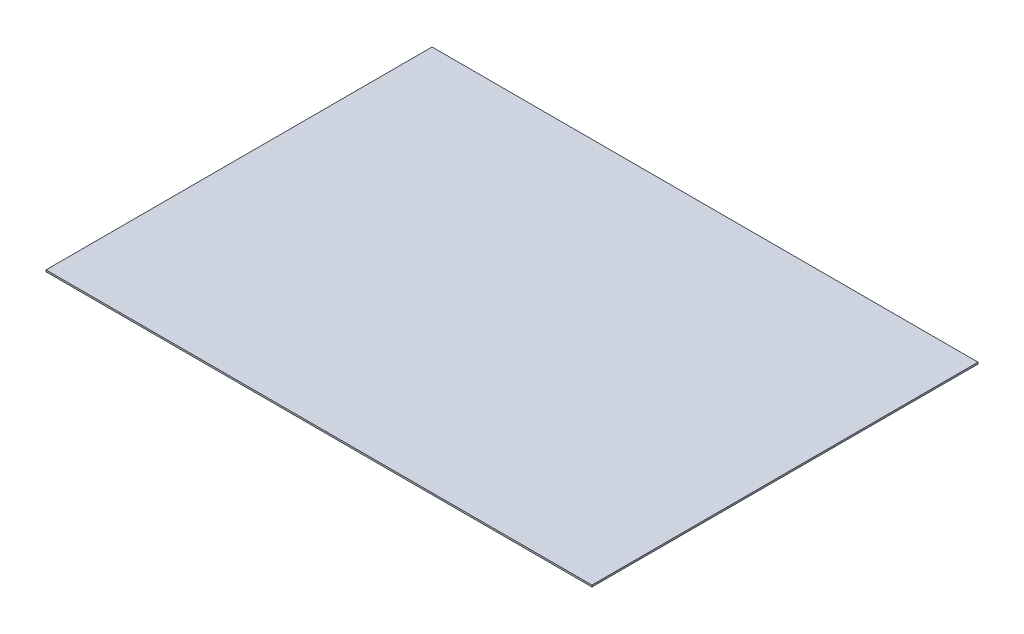
ISO-10303-21;
HEADER;
FILE_DESCRIPTION(('STEP AP214'),'2;1');
FILE_NAME('part.step','',(''),(''),'','','');
FILE_SCHEMA(('AUTOMOTIVE_DESIGN { 1 0 10303 214 1 1 1 1 }'));
ENDSEC;
DATA;
#1=APPLICATION_CONTEXT('core data for automotive mechanical design processes');
#2=APPLICATION_PROTOCOL_DEFINITION('international standard','automotive_design',2000,#1);
#3=PRODUCT_CONTEXT('',#1,'mechanical');
#4=PRODUCT('Part','Part','',(#3));
#5=PRODUCT_RELATED_PRODUCT_CATEGORY('part','',(#4));
#6=PRODUCT_DEFINITION_FORMATION('','',#4);
#7=PRODUCT_DEFINITION_CONTEXT('part definition',#1,'design');
#8=PRODUCT_DEFINITION('design','',#6,#7);
#9=PRODUCT_DEFINITION_SHAPE('','',#8);
#10=(LENGTH_UNIT() NAMED_UNIT(*) SI_UNIT(.MILLI.,.METRE.));
#11=(NAMED_UNIT(*) PLANE_ANGLE_UNIT() SI_UNIT($,.RADIAN.));
#12=(NAMED_UNIT(*) SI_UNIT($,.STERADIAN.) SOLID_ANGLE_UNIT());
#13=UNCERTAINTY_MEASURE_WITH_UNIT(LENGTH_MEASURE(1.E-05),#10,'distance_accuracy_value','');
#14=(GEOMETRIC_REPRESENTATION_CONTEXT(3) GLOBAL_UNCERTAINTY_ASSIGNED_CONTEXT((#13)) GLOBAL_UNIT_ASSIGNED_CONTEXT((#10,
#11,#12)) REPRESENTATION_CONTEXT('',''));
#15=CARTESIAN_POINT('',(0.,0.,0.));
#16=DIRECTION('',(0.,0.,1.));
#17=DIRECTION('',(1.,0.,0.));
#18=AXIS2_PLACEMENT_3D('',#15,#16,#17);
#19=CARTESIAN_POINT('',(210.,1.3,-148.5));
#20=DIRECTION('',(-1.,0.,0.));
#21=DIRECTION('',(0.,0.,1.));
#22=AXIS2_PLACEMENT_3D('',#19,#20,#21);
#23=PLANE('',#22);
#24=DIRECTION('',(0.,0.,-1.));
#25=VECTOR('',#24,1.);
#26=CARTESIAN_POINT('',(210.,0.,-148.5));
#27=LINE('',#26,#25);
#28=CARTESIAN_POINT('',(210.,0.,148.5));
#29=VERTEX_POINT('',#28);
#30=CARTESIAN_POINT('',(210.,0.,-148.5));
#31=VERTEX_POINT('',#30);
#32=EDGE_CURVE('E111',#29,#31,#27,.T.);
#33=ORIENTED_EDGE('',*,*,#32,.T.);
#34=DIRECTION('',(0.,-1.,0.));
#35=VECTOR('',#34,1.);
#36=CARTESIAN_POINT('',(210.,1.3,-148.5));
#37=LINE('',#36,#35);
#38=CARTESIAN_POINT('',(210.,1.3,-148.5));
#39=VERTEX_POINT('',#38);
#40=EDGE_CURVE('E11',#39,#31,#37,.T.);
#41=ORIENTED_EDGE('',*,*,#40,.F.);
#42=DIRECTION('',(0.,0.,-1.));
#43=VECTOR('',#42,1.);
#44=CARTESIAN_POINT('',(210.,1.3,-148.5));
#45=LINE('',#44,#43);
#46=CARTESIAN_POINT('',(210.,1.3,148.5));
#47=VERTEX_POINT('',#46);
#48=EDGE_CURVE('E95',#47,#39,#45,.T.);
#49=ORIENTED_EDGE('',*,*,#48,.F.);
#50=DIRECTION('',(0.,-1.,0.));
#51=VECTOR('',#50,1.);
#52=CARTESIAN_POINT('',(210.,1.3,148.5));
#53=LINE('',#52,#51);
#54=EDGE_CURVE('E107',#47,#29,#53,.T.);
#55=ORIENTED_EDGE('',*,*,#54,.T.);
#56=EDGE_LOOP('',(#33,#41,#49,#55));
#57=FACE_BOUND('',#56,.T.);
#58=ADVANCED_FACE('F43',(#57),#23,.F.);
#59=CARTESIAN_POINT('',(-210.,1.3,-148.5));
#60=DIRECTION('',(0.,0.,1.));
#61=DIRECTION('',(1.,0.,0.));
#62=AXIS2_PLACEMENT_3D('',#59,#60,#61);
#63=PLANE('',#62);
#64=DIRECTION('',(-1.,0.,0.));
#65=VECTOR('',#64,1.);
#66=CARTESIAN_POINT('',(-210.,0.,-148.5));
#67=LINE('',#66,#65);
#68=CARTESIAN_POINT('',(-210.,0.,-148.5));
#69=VERTEX_POINT('',#68);
#70=EDGE_CURVE('E100',#31,#69,#67,.T.);
#71=ORIENTED_EDGE('',*,*,#70,.T.);
#72=DIRECTION('',(0.,-1.,0.));
#73=VECTOR('',#72,1.);
#74=CARTESIAN_POINT('',(-210.,1.3,-148.5));
#75=LINE('',#74,#73);
#76=CARTESIAN_POINT('',(-210.,1.3,-148.5));
#77=VERTEX_POINT('',#76);
#78=EDGE_CURVE('E52',#77,#69,#75,.T.);
#79=ORIENTED_EDGE('',*,*,#78,.F.);
#80=DIRECTION('',(-1.,0.,0.));
#81=VECTOR('',#80,1.);
#82=CARTESIAN_POINT('',(-210.,1.3,-148.5));
#83=LINE('',#82,#81);
#84=EDGE_CURVE('E90',#39,#77,#83,.T.);
#85=ORIENTED_EDGE('',*,*,#84,.F.);
#86=ORIENTED_EDGE('',*,*,#40,.T.);
#87=EDGE_LOOP('',(#71,#79,#85,#86));
#88=FACE_BOUND('',#87,.T.);
#89=ADVANCED_FACE('F99',(#88),#63,.F.);
#90=CARTESIAN_POINT('',(-210.,1.3,-148.5));
#91=DIRECTION('',(1.,0.,0.));
#92=DIRECTION('',(0.,0.,-1.));
#93=AXIS2_PLACEMENT_3D('',#90,#91,#92);
#94=PLANE('',#93);
#95=DIRECTION('',(0.,0.,1.));
#96=VECTOR('',#95,1.);
#97=CARTESIAN_POINT('',(-210.,0.,-148.5));
#98=LINE('',#97,#96);
#99=CARTESIAN_POINT('',(-210.,0.,148.5));
#100=VERTEX_POINT('',#99);
#101=EDGE_CURVE('E77',#69,#100,#98,.T.);
#102=ORIENTED_EDGE('',*,*,#101,.T.);
#103=DIRECTION('',(0.,-1.,0.));
#104=VECTOR('',#103,1.);
#105=CARTESIAN_POINT('',(-210.,1.3,148.5));
#106=LINE('',#105,#104);
#107=CARTESIAN_POINT('',(-210.,1.3,148.5));
#108=VERTEX_POINT('',#107);
#109=EDGE_CURVE('E102',#108,#100,#106,.T.);
#110=ORIENTED_EDGE('',*,*,#109,.F.);
#111=DIRECTION('',(0.,0.,1.));
#112=VECTOR('',#111,1.);
#113=CARTESIAN_POINT('',(-210.,1.3,-148.5));
#114=LINE('',#113,#112);
#115=EDGE_CURVE('E93',#77,#108,#114,.T.);
#116=ORIENTED_EDGE('',*,*,#115,.F.);
#117=ORIENTED_EDGE('',*,*,#78,.T.);
#118=EDGE_LOOP('',(#102,#110,#116,#117));
#119=FACE_BOUND('',#118,.T.);
#120=ADVANCED_FACE('F103',(#119),#94,.F.);
#121=CARTESIAN_POINT('',(-210.,1.3,148.5));
#122=DIRECTION('',(0.,0.,-1.));
#123=DIRECTION('',(-1.,0.,0.));
#124=AXIS2_PLACEMENT_3D('',#121,#122,#123);
#125=PLANE('',#124);
#126=DIRECTION('',(1.,0.,0.));
#127=VECTOR('',#126,1.);
#128=CARTESIAN_POINT('',(-210.,0.,148.5));
#129=LINE('',#128,#127);
#130=EDGE_CURVE('E83',#100,#29,#129,.T.);
#131=ORIENTED_EDGE('',*,*,#130,.T.);
#132=ORIENTED_EDGE('',*,*,#54,.F.);
#133=DIRECTION('',(1.,0.,0.));
#134=VECTOR('',#133,1.);
#135=CARTESIAN_POINT('',(-210.,1.3,148.5));
#136=LINE('',#135,#134);
#137=EDGE_CURVE('E60',#108,#47,#136,.T.);
#138=ORIENTED_EDGE('',*,*,#137,.F.);
#139=ORIENTED_EDGE('',*,*,#109,.T.);
#140=EDGE_LOOP('',(#131,#132,#138,#139));
#141=FACE_BOUND('',#140,.T.);
#142=ADVANCED_FACE('F124',(#141),#125,.F.);
#143=CARTESIAN_POINT('',(0.,1.3,0.));
#144=DIRECTION('',(0.,1.,0.));
#145=DIRECTION('',(0.,0.,1.));
#146=AXIS2_PLACEMENT_3D('',#143,#144,#145);
#147=PLANE('',#146);
#148=ORIENTED_EDGE('',*,*,#48,.T.);
#149=ORIENTED_EDGE('',*,*,#84,.T.);
#150=ORIENTED_EDGE('',*,*,#115,.T.);
#151=ORIENTED_EDGE('',*,*,#137,.T.);
#152=EDGE_LOOP('',(#148,#149,#150,#151));
#153=FACE_BOUND('',#152,.T.);
#154=ADVANCED_FACE('F91',(#153),#147,.T.);
#155=CARTESIAN_POINT('',(0.,0.,0.));
#156=DIRECTION('',(0.,1.,0.));
#157=DIRECTION('',(0.,0.,1.));
#158=AXIS2_PLACEMENT_3D('',#155,#156,#157);
#159=PLANE('',#158);
#160=ORIENTED_EDGE('',*,*,#32,.F.);
#161=ORIENTED_EDGE('',*,*,#130,.F.);
#162=ORIENTED_EDGE('',*,*,#101,.F.);
#163=ORIENTED_EDGE('',*,*,#70,.F.);
#164=EDGE_LOOP('',(#160,#161,#162,#163));
#165=FACE_BOUND('',#164,.T.);
#166=ADVANCED_FACE('F127',(#165),#159,.F.);
#167=CLOSED_SHELL('',(#58,#89,#120,#142,#154,#166));
#168=MANIFOLD_SOLID_BREP('B2',#167);
#169=ADVANCED_BREP_SHAPE_REPRESENTATION('',(#18,#168),#14);
#170=SHAPE_DEFINITION_REPRESENTATION(#9,#169);
ENDSEC;
END-ISO-10303-21;
